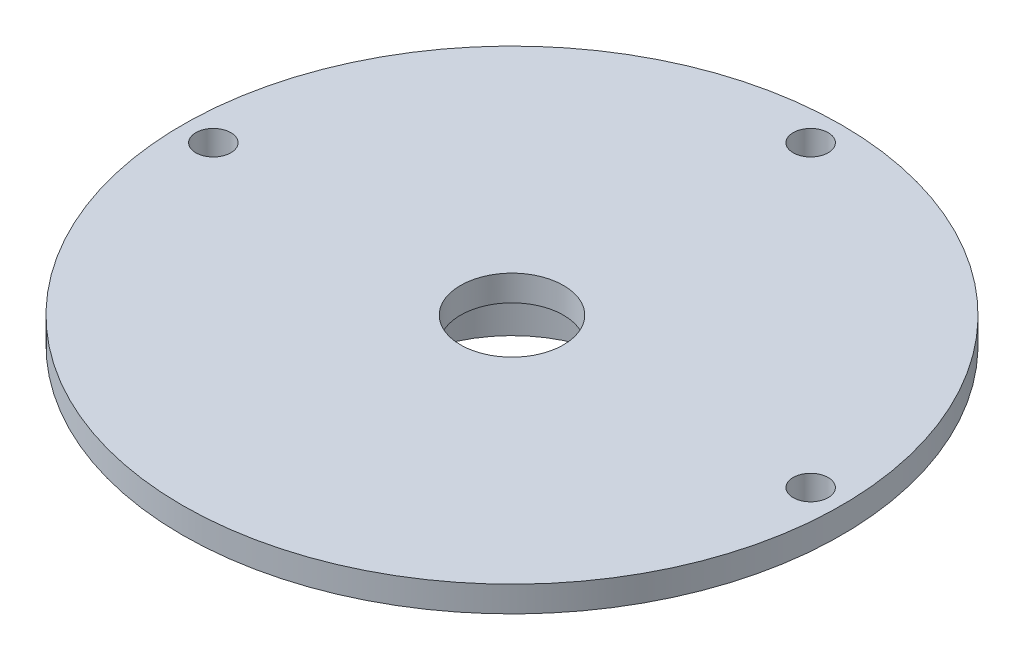
ISO-10303-21;
HEADER;
FILE_DESCRIPTION(('STEP AP214'),'2;1');
FILE_NAME('part.step','',(''),(''),'','','');
FILE_SCHEMA(('AUTOMOTIVE_DESIGN { 1 0 10303 214 1 1 1 1 }'));
ENDSEC;
DATA;
#1=APPLICATION_CONTEXT('core data for automotive mechanical design processes');
#2=APPLICATION_PROTOCOL_DEFINITION('international standard','automotive_design',2000,#1);
#3=PRODUCT_CONTEXT('',#1,'mechanical');
#4=PRODUCT('Part','Part','',(#3));
#5=PRODUCT_RELATED_PRODUCT_CATEGORY('part','',(#4));
#6=PRODUCT_DEFINITION_FORMATION('','',#4);
#7=PRODUCT_DEFINITION_CONTEXT('part definition',#1,'design');
#8=PRODUCT_DEFINITION('design','',#6,#7);
#9=PRODUCT_DEFINITION_SHAPE('','',#8);
#10=(LENGTH_UNIT() NAMED_UNIT(*) SI_UNIT(.MILLI.,.METRE.));
#11=(NAMED_UNIT(*) PLANE_ANGLE_UNIT() SI_UNIT($,.RADIAN.));
#12=(NAMED_UNIT(*) SI_UNIT($,.STERADIAN.) SOLID_ANGLE_UNIT());
#13=UNCERTAINTY_MEASURE_WITH_UNIT(LENGTH_MEASURE(1.E-05),#10,'distance_accuracy_value','');
#14=(GEOMETRIC_REPRESENTATION_CONTEXT(3) GLOBAL_UNCERTAINTY_ASSIGNED_CONTEXT((#13)) GLOBAL_UNIT_ASSIGNED_CONTEXT((#10,
#11,#12)) REPRESENTATION_CONTEXT('',''));
#15=CARTESIAN_POINT('',(0.,0.,0.));
#16=DIRECTION('',(0.,0.,1.));
#17=DIRECTION('',(1.,0.,0.));
#18=AXIS2_PLACEMENT_3D('',#15,#16,#17);
#19=CARTESIAN_POINT('',(0.,2.5,0.));
#20=DIRECTION('',(0.,1.,0.));
#21=DIRECTION('',(0.,0.,1.));
#22=AXIS2_PLACEMENT_3D('',#19,#20,#21);
#23=PLANE('',#22);
#24=CARTESIAN_POINT('',(0.,2.5,0.));
#25=DIRECTION('',(0.,1.,0.));
#26=DIRECTION('',(0.,0.,1.));
#27=AXIS2_PLACEMENT_3D('',#24,#25,#26);
#28=CIRCLE('',#27,5.);
#29=CARTESIAN_POINT('',(0.,2.5,5.));
#30=VERTEX_POINT('',#29);
#31=EDGE_CURVE('E47',#30,#30,#28,.T.);
#32=ORIENTED_EDGE('',*,*,#31,.F.);
#33=EDGE_LOOP('',(#32));
#34=FACE_BOUND('',#33,.T.);
#35=CARTESIAN_POINT('',(-29.,2.5,-2.02505917652902E-13));
#36=DIRECTION('',(0.,1.,0.));
#37=DIRECTION('',(0.,0.,1.));
#38=AXIS2_PLACEMENT_3D('',#35,#36,#37);
#39=CIRCLE('',#38,1.7);
#40=CARTESIAN_POINT('',(-29.,2.5,1.6999999999998));
#41=VERTEX_POINT('',#40);
#42=EDGE_CURVE('E68',#41,#41,#39,.T.);
#43=ORIENTED_EDGE('',*,*,#42,.F.);
#44=EDGE_LOOP('',(#43));
#45=FACE_BOUND('',#44,.T.);
#46=CARTESIAN_POINT('',(0.,2.5,0.));
#47=DIRECTION('',(0.,1.,0.));
#48=DIRECTION('',(0.,0.,1.));
#49=AXIS2_PLACEMENT_3D('',#46,#47,#48);
#50=CIRCLE('',#49,32.);
#51=CARTESIAN_POINT('',(0.,2.5,32.));
#52=VERTEX_POINT('',#51);
#53=EDGE_CURVE('E52',#52,#52,#50,.T.);
#54=ORIENTED_EDGE('',*,*,#53,.T.);
#55=EDGE_LOOP('',(#54));
#56=FACE_BOUND('',#55,.T.);
#57=CARTESIAN_POINT('',(29.,2.5,0.));
#58=DIRECTION('',(0.,1.,0.));
#59=DIRECTION('',(0.,0.,1.));
#60=AXIS2_PLACEMENT_3D('',#57,#58,#59);
#61=CIRCLE('',#60,1.7);
#62=CARTESIAN_POINT('',(29.,2.5,1.7));
#63=VERTEX_POINT('',#62);
#64=EDGE_CURVE('E62',#63,#63,#61,.T.);
#65=ORIENTED_EDGE('',*,*,#64,.F.);
#66=EDGE_LOOP('',(#65));
#67=FACE_BOUND('',#66,.T.);
#68=CARTESIAN_POINT('',(3.03758876479353E-13,2.5,-29.));
#69=DIRECTION('',(0.,1.,0.));
#70=DIRECTION('',(0.,0.,1.));
#71=AXIS2_PLACEMENT_3D('',#68,#69,#70);
#72=CIRCLE('',#71,1.7);
#73=CARTESIAN_POINT('',(3.03758876479353E-13,2.5,-27.3));
#74=VERTEX_POINT('',#73);
#75=EDGE_CURVE('E76',#74,#74,#72,.T.);
#76=ORIENTED_EDGE('',*,*,#75,.F.);
#77=EDGE_LOOP('',(#76));
#78=FACE_BOUND('',#77,.T.);
#79=ADVANCED_FACE('F43',(#34,#45,#56,#67,#78),#23,.T.);
#80=CARTESIAN_POINT('',(0.,0.,0.));
#81=DIRECTION('',(0.,1.,0.));
#82=DIRECTION('',(0.,0.,1.));
#83=AXIS2_PLACEMENT_3D('',#80,#81,#82);
#84=PLANE('',#83);
#85=CARTESIAN_POINT('',(0.,0.,0.));
#86=DIRECTION('',(0.,1.,0.));
#87=DIRECTION('',(0.,0.,1.));
#88=AXIS2_PLACEMENT_3D('',#85,#86,#87);
#89=CIRCLE('',#88,16.);
#90=CARTESIAN_POINT('',(0.,0.,16.));
#91=VERTEX_POINT('',#90);
#92=EDGE_CURVE('E10',#91,#91,#89,.F.);
#93=ORIENTED_EDGE('',*,*,#92,.F.);
#94=EDGE_LOOP('',(#93));
#95=FACE_BOUND('',#94,.T.);
#96=CARTESIAN_POINT('',(0.,0.,0.));
#97=DIRECTION('',(0.,1.,0.));
#98=DIRECTION('',(0.,0.,1.));
#99=AXIS2_PLACEMENT_3D('',#96,#97,#98);
#100=CIRCLE('',#99,32.);
#101=CARTESIAN_POINT('',(0.,0.,32.));
#102=VERTEX_POINT('',#101);
#103=EDGE_CURVE('E57',#102,#102,#100,.T.);
#104=ORIENTED_EDGE('',*,*,#103,.F.);
#105=EDGE_LOOP('',(#104));
#106=FACE_BOUND('',#105,.T.);
#107=CARTESIAN_POINT('',(29.,0.,0.));
#108=DIRECTION('',(0.,1.,0.));
#109=DIRECTION('',(0.,0.,1.));
#110=AXIS2_PLACEMENT_3D('',#107,#108,#109);
#111=CIRCLE('',#110,1.7);
#112=CARTESIAN_POINT('',(29.,0.,1.7));
#113=VERTEX_POINT('',#112);
#114=EDGE_CURVE('E64',#113,#113,#111,.T.);
#115=ORIENTED_EDGE('',*,*,#114,.T.);
#116=EDGE_LOOP('',(#115));
#117=FACE_BOUND('',#116,.T.);
#118=CARTESIAN_POINT('',(-29.,0.,-2.02505917652902E-13));
#119=DIRECTION('',(0.,1.,0.));
#120=DIRECTION('',(0.,0.,1.));
#121=AXIS2_PLACEMENT_3D('',#118,#119,#120);
#122=CIRCLE('',#121,1.7);
#123=CARTESIAN_POINT('',(-29.,0.,1.6999999999998));
#124=VERTEX_POINT('',#123);
#125=EDGE_CURVE('E72',#124,#124,#122,.T.);
#126=ORIENTED_EDGE('',*,*,#125,.T.);
#127=EDGE_LOOP('',(#126));
#128=FACE_BOUND('',#127,.T.);
#129=CARTESIAN_POINT('',(3.03758876479353E-13,0.,-29.));
#130=DIRECTION('',(0.,1.,0.));
#131=DIRECTION('',(0.,0.,1.));
#132=AXIS2_PLACEMENT_3D('',#129,#130,#131);
#133=CIRCLE('',#132,1.7);
#134=CARTESIAN_POINT('',(3.03758876479353E-13,0.,-27.3));
#135=VERTEX_POINT('',#134);
#136=EDGE_CURVE('E80',#135,#135,#133,.T.);
#137=ORIENTED_EDGE('',*,*,#136,.T.);
#138=EDGE_LOOP('',(#137));
#139=FACE_BOUND('',#138,.T.);
#140=ADVANCED_FACE('F112',(#95,#106,#117,#128,#139),#84,.F.);
#141=CARTESIAN_POINT('',(0.,2.5,0.));
#142=DIRECTION('',(0.,-1.,0.));
#143=DIRECTION('',(0.,0.,-1.));
#144=AXIS2_PLACEMENT_3D('',#141,#142,#143);
#145=CYLINDRICAL_SURFACE('',#144,32.);
#146=ORIENTED_EDGE('',*,*,#53,.F.);
#147=EDGE_LOOP('',(#146));
#148=FACE_BOUND('',#147,.T.);
#149=ORIENTED_EDGE('',*,*,#103,.T.);
#150=EDGE_LOOP('',(#149));
#151=FACE_BOUND('',#150,.T.);
#152=ADVANCED_FACE('F45',(#148,#151),#145,.T.);
#153=CARTESIAN_POINT('',(29.,2.5,0.));
#154=DIRECTION('',(0.,-1.,0.));
#155=DIRECTION('',(0.,0.,-1.));
#156=AXIS2_PLACEMENT_3D('',#153,#154,#155);
#157=CYLINDRICAL_SURFACE('',#156,1.7);
#158=ORIENTED_EDGE('',*,*,#64,.T.);
#159=EDGE_LOOP('',(#158));
#160=FACE_BOUND('',#159,.T.);
#161=ORIENTED_EDGE('',*,*,#114,.F.);
#162=EDGE_LOOP('',(#161));
#163=FACE_BOUND('',#162,.T.);
#164=ADVANCED_FACE('F137',(#160,#163),#157,.F.);
#165=CARTESIAN_POINT('',(-29.,2.5,-2.02505917652902E-13));
#166=DIRECTION('',(0.,-1.,0.));
#167=DIRECTION('',(0.,0.,-1.));
#168=AXIS2_PLACEMENT_3D('',#165,#166,#167);
#169=CYLINDRICAL_SURFACE('',#168,1.7);
#170=ORIENTED_EDGE('',*,*,#42,.T.);
#171=EDGE_LOOP('',(#170));
#172=FACE_BOUND('',#171,.T.);
#173=ORIENTED_EDGE('',*,*,#125,.F.);
#174=EDGE_LOOP('',(#173));
#175=FACE_BOUND('',#174,.T.);
#176=ADVANCED_FACE('F126',(#172,#175),#169,.F.);
#177=CARTESIAN_POINT('',(3.03758876479353E-13,2.5,-29.));
#178=DIRECTION('',(0.,-1.,0.));
#179=DIRECTION('',(0.,0.,-1.));
#180=AXIS2_PLACEMENT_3D('',#177,#178,#179);
#181=CYLINDRICAL_SURFACE('',#180,1.7);
#182=ORIENTED_EDGE('',*,*,#75,.T.);
#183=EDGE_LOOP('',(#182));
#184=FACE_BOUND('',#183,.T.);
#185=ORIENTED_EDGE('',*,*,#136,.F.);
#186=EDGE_LOOP('',(#185));
#187=FACE_BOUND('',#186,.T.);
#188=ADVANCED_FACE('F122',(#184,#187),#181,.F.);
#189=CARTESIAN_POINT('',(0.,-7.,0.));
#190=DIRECTION('',(0.,-1.,0.));
#191=DIRECTION('',(0.,0.,-1.));
#192=AXIS2_PLACEMENT_3D('',#189,#190,#191);
#193=PLANE('',#192);
#194=CARTESIAN_POINT('',(0.,-7.,0.));
#195=DIRECTION('',(0.,-1.,0.));
#196=DIRECTION('',(0.,0.,-1.));
#197=AXIS2_PLACEMENT_3D('',#194,#195,#196);
#198=CIRCLE('',#197,16.);
#199=CARTESIAN_POINT('',(0.,-7.,-16.));
#200=VERTEX_POINT('',#199);
#201=EDGE_CURVE('E84',#200,#200,#198,.T.);
#202=ORIENTED_EDGE('',*,*,#201,.T.);
#203=EDGE_LOOP('',(#202));
#204=FACE_BOUND('',#203,.T.);
#205=CARTESIAN_POINT('',(0.,-7.,0.));
#206=DIRECTION('',(0.,-1.,0.));
#207=DIRECTION('',(0.,0.,-1.));
#208=AXIS2_PLACEMENT_3D('',#205,#206,#207);
#209=CIRCLE('',#208,11.);
#210=CARTESIAN_POINT('',(0.,-7.,-11.));
#211=VERTEX_POINT('',#210);
#212=EDGE_CURVE('E91',#211,#211,#209,.T.);
#213=ORIENTED_EDGE('',*,*,#212,.F.);
#214=EDGE_LOOP('',(#213));
#215=FACE_BOUND('',#214,.T.);
#216=ADVANCED_FACE('F125',(#204,#215),#193,.T.);
#217=CARTESIAN_POINT('',(0.,-7.,0.));
#218=DIRECTION('',(0.,1.,0.));
#219=DIRECTION('',(0.,0.,1.));
#220=AXIS2_PLACEMENT_3D('',#217,#218,#219);
#221=CYLINDRICAL_SURFACE('',#220,16.);
#222=ORIENTED_EDGE('',*,*,#201,.F.);
#223=EDGE_LOOP('',(#222));
#224=FACE_BOUND('',#223,.T.);
#225=ORIENTED_EDGE('',*,*,#92,.T.);
#226=EDGE_LOOP('',(#225));
#227=FACE_BOUND('',#226,.T.);
#228=ADVANCED_FACE('F148',(#224,#227),#221,.T.);
#229=CARTESIAN_POINT('',(0.,-7.,0.));
#230=DIRECTION('',(0.,1.,0.));
#231=DIRECTION('',(0.,0.,1.));
#232=AXIS2_PLACEMENT_3D('',#229,#230,#231);
#233=CYLINDRICAL_SURFACE('',#232,11.);
#234=ORIENTED_EDGE('',*,*,#212,.T.);
#235=EDGE_LOOP('',(#234));
#236=FACE_BOUND('',#235,.T.);
#237=CARTESIAN_POINT('',(0.,0.,0.));
#238=DIRECTION('',(0.,-1.,0.));
#239=DIRECTION('',(0.,0.,-1.));
#240=AXIS2_PLACEMENT_3D('',#237,#238,#239);
#241=CIRCLE('',#240,11.);
#242=CARTESIAN_POINT('',(0.,0.,-11.));
#243=VERTEX_POINT('',#242);
#244=EDGE_CURVE('E92',#243,#243,#241,.T.);
#245=ORIENTED_EDGE('',*,*,#244,.F.);
#246=EDGE_LOOP('',(#245));
#247=FACE_BOUND('',#246,.T.);
#248=ADVANCED_FACE('F141',(#236,#247),#233,.F.);
#249=CARTESIAN_POINT('',(0.,0.,0.));
#250=DIRECTION('',(0.,-1.,0.));
#251=DIRECTION('',(0.,0.,-1.));
#252=AXIS2_PLACEMENT_3D('',#249,#250,#251);
#253=CIRCLE('',#252,5.);
#254=CARTESIAN_POINT('',(0.,0.,-5.));
#255=VERTEX_POINT('',#254);
#256=EDGE_CURVE('E99',#255,#255,#253,.T.);
#257=ORIENTED_EDGE('',*,*,#256,.F.);
#258=EDGE_LOOP('',(#257));
#259=FACE_BOUND('',#258,.T.);
#260=ORIENTED_EDGE('',*,*,#244,.T.);
#261=EDGE_LOOP('',(#260));
#262=FACE_BOUND('',#261,.T.);
#263=ADVANCED_FACE('F132',(#259,#262),#84,.F.);
#264=CARTESIAN_POINT('',(0.,7.,0.));
#265=DIRECTION('',(0.,-1.,0.));
#266=DIRECTION('',(0.,0.,-1.));
#267=AXIS2_PLACEMENT_3D('',#264,#265,#266);
#268=CYLINDRICAL_SURFACE('',#267,5.);
#269=ORIENTED_EDGE('',*,*,#31,.T.);
#270=EDGE_LOOP('',(#269));
#271=FACE_BOUND('',#270,.T.);
#272=ORIENTED_EDGE('',*,*,#256,.T.);
#273=EDGE_LOOP('',(#272));
#274=FACE_BOUND('',#273,.T.);
#275=ADVANCED_FACE('F108',(#271,#274),#268,.F.);
#276=CLOSED_SHELL('',(#79,#140,#152,#164,#176,#188,#216,#228,#248,#263,#275));
#277=MANIFOLD_SOLID_BREP('B2',#276);
#278=ADVANCED_BREP_SHAPE_REPRESENTATION('',(#18,#277),#14);
#279=SHAPE_DEFINITION_REPRESENTATION(#9,#278);
ENDSEC;
END-ISO-10303-21;
